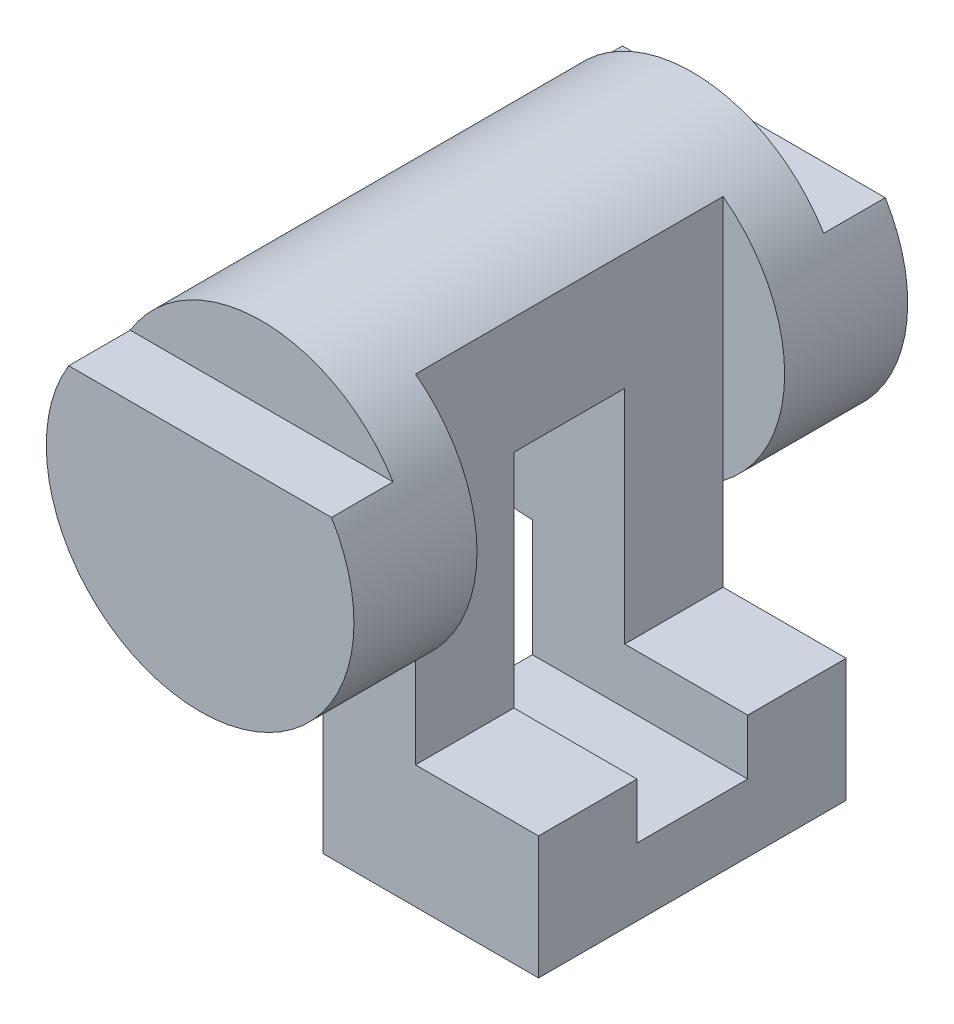
ISO-10303-21;
HEADER;
FILE_DESCRIPTION(('STEP AP214'),'2;1');
FILE_NAME('part.step','',(''),(''),'','','');
FILE_SCHEMA(('AUTOMOTIVE_DESIGN { 1 0 10303 214 1 1 1 1 }'));
ENDSEC;
DATA;
#1=APPLICATION_CONTEXT('core data for automotive mechanical design processes');
#2=APPLICATION_PROTOCOL_DEFINITION('international standard','automotive_design',2000,#1);
#3=PRODUCT_CONTEXT('',#1,'mechanical');
#4=PRODUCT('Part','Part','',(#3));
#5=PRODUCT_RELATED_PRODUCT_CATEGORY('part','',(#4));
#6=PRODUCT_DEFINITION_FORMATION('','',#4);
#7=PRODUCT_DEFINITION_CONTEXT('part definition',#1,'design');
#8=PRODUCT_DEFINITION('design','',#6,#7);
#9=PRODUCT_DEFINITION_SHAPE('','',#8);
#10=(LENGTH_UNIT() NAMED_UNIT(*) SI_UNIT(.MILLI.,.METRE.));
#11=(NAMED_UNIT(*) PLANE_ANGLE_UNIT() SI_UNIT($,.RADIAN.));
#12=(NAMED_UNIT(*) SI_UNIT($,.STERADIAN.) SOLID_ANGLE_UNIT());
#13=UNCERTAINTY_MEASURE_WITH_UNIT(LENGTH_MEASURE(1.E-05),#10,'distance_accuracy_value','');
#14=(GEOMETRIC_REPRESENTATION_CONTEXT(3) GLOBAL_UNCERTAINTY_ASSIGNED_CONTEXT((#13)) GLOBAL_UNIT_ASSIGNED_CONTEXT((#10,
#11,#12)) REPRESENTATION_CONTEXT('',''));
#15=CARTESIAN_POINT('',(0.,0.,0.));
#16=DIRECTION('',(0.,0.,1.));
#17=DIRECTION('',(1.,0.,0.));
#18=AXIS2_PLACEMENT_3D('',#15,#16,#17);
#19=CARTESIAN_POINT('',(-15.,35.,25.));
#20=DIRECTION('',(0.,0.,-1.));
#21=DIRECTION('',(-1.,0.,0.));
#22=AXIS2_PLACEMENT_3D('',#19,#20,#21);
#23=CYLINDRICAL_SURFACE('',#22,25.);
#24=CARTESIAN_POINT('',(-15.,35.,-45.));
#25=DIRECTION('',(0.,0.,1.));
#26=DIRECTION('',(1.,0.,0.));
#27=AXIS2_PLACEMENT_3D('',#24,#25,#26);
#28=CIRCLE('',#27,25.);
#29=CARTESIAN_POINT('',(-36.3541565040626,48.,-45.));
#30=VERTEX_POINT('',#29);
#31=CARTESIAN_POINT('',(6.35415650406259,48.,-45.));
#32=VERTEX_POINT('',#31);
#33=EDGE_CURVE('E196',#30,#32,#28,.T.);
#34=ORIENTED_EDGE('',*,*,#33,.T.);
#35=DIRECTION('',(0.,0.,-1.));
#36=VECTOR('',#35,1.);
#37=CARTESIAN_POINT('',(6.3541565040626,48.,25.));
#38=LINE('',#37,#36);
#39=CARTESIAN_POINT('',(6.3541565040626,48.,-35.));
#40=VERTEX_POINT('',#39);
#41=EDGE_CURVE('E321',#32,#40,#38,.F.);
#42=ORIENTED_EDGE('',*,*,#41,.T.);
#43=CARTESIAN_POINT('',(-15.,35.,-35.));
#44=DIRECTION('',(0.,0.,1.));
#45=DIRECTION('',(1.,0.,0.));
#46=AXIS2_PLACEMENT_3D('',#43,#44,#45);
#47=CIRCLE('',#46,25.);
#48=CARTESIAN_POINT('',(-36.3541565040626,48.,-35.));
#49=VERTEX_POINT('',#48);
#50=EDGE_CURVE('E252',#40,#49,#47,.T.);
#51=ORIENTED_EDGE('',*,*,#50,.T.);
#52=DIRECTION('',(0.,0.,-1.));
#53=VECTOR('',#52,1.);
#54=CARTESIAN_POINT('',(-36.3541565040626,48.,25.));
#55=LINE('',#54,#53);
#56=EDGE_CURVE('E289',#49,#30,#55,.T.);
#57=ORIENTED_EDGE('',*,*,#56,.T.);
#58=EDGE_LOOP('',(#34,#42,#51,#57));
#59=FACE_BOUND('',#58,.T.);
#60=CARTESIAN_POINT('',(-15.,35.,45.));
#61=DIRECTION('',(0.,0.,1.));
#62=DIRECTION('',(1.,0.,0.));
#63=AXIS2_PLACEMENT_3D('',#60,#61,#62);
#64=CIRCLE('',#63,25.);
#65=CARTESIAN_POINT('',(-36.3541565040626,48.,45.));
#66=VERTEX_POINT('',#65);
#67=CARTESIAN_POINT('',(6.3541565040626,48.,45.));
#68=VERTEX_POINT('',#67);
#69=EDGE_CURVE('E190',#66,#68,#64,.T.);
#70=ORIENTED_EDGE('',*,*,#69,.F.);
#71=DIRECTION('',(0.,0.,-1.));
#72=VECTOR('',#71,1.);
#73=CARTESIAN_POINT('',(-36.3541565040626,48.,25.));
#74=LINE('',#73,#72);
#75=CARTESIAN_POINT('',(-36.3541565040626,48.,35.));
#76=VERTEX_POINT('',#75);
#77=EDGE_CURVE('E318',#66,#76,#74,.T.);
#78=ORIENTED_EDGE('',*,*,#77,.T.);
#79=CARTESIAN_POINT('',(-15.,35.,35.));
#80=DIRECTION('',(0.,0.,-1.));
#81=DIRECTION('',(-1.,0.,0.));
#82=AXIS2_PLACEMENT_3D('',#79,#80,#81);
#83=CIRCLE('',#82,25.);
#84=CARTESIAN_POINT('',(6.35415650406261,48.,35.));
#85=VERTEX_POINT('',#84);
#86=EDGE_CURVE('E255',#76,#85,#83,.T.);
#87=ORIENTED_EDGE('',*,*,#86,.T.);
#88=DIRECTION('',(0.,0.,-1.));
#89=VECTOR('',#88,1.);
#90=CARTESIAN_POINT('',(6.35415650406261,48.,25.));
#91=LINE('',#90,#89);
#92=EDGE_CURVE('E301',#85,#68,#91,.F.);
#93=ORIENTED_EDGE('',*,*,#92,.T.);
#94=EDGE_LOOP('',(#70,#78,#87,#93));
#95=FACE_BOUND('',#94,.T.);
#96=CARTESIAN_POINT('',(-15.,35.,25.));
#97=DIRECTION('',(0.,0.,1.));
#98=DIRECTION('',(1.,0.,0.));
#99=AXIS2_PLACEMENT_3D('',#96,#97,#98);
#100=CIRCLE('',#99,25.);
#101=CARTESIAN_POINT('',(0.,15.,25.));
#102=VERTEX_POINT('',#101);
#103=CARTESIAN_POINT('',(-15.,10.,25.));
#104=VERTEX_POINT('',#103);
#105=EDGE_CURVE('E185',#102,#104,#100,.F.);
#106=ORIENTED_EDGE('',*,*,#105,.F.);
#107=CARTESIAN_POINT('',(-15.,35.,25.));
#108=DIRECTION('',(0.,0.,-1.));
#109=DIRECTION('',(-1.,0.,0.));
#110=AXIS2_PLACEMENT_3D('',#107,#108,#109);
#111=CIRCLE('',#110,25.);
#112=CARTESIAN_POINT('',(0.,55.,25.));
#113=VERTEX_POINT('',#112);
#114=EDGE_CURVE('E11',#113,#102,#111,.T.);
#115=ORIENTED_EDGE('',*,*,#114,.F.);
#116=DIRECTION('',(0.,0.,-1.));
#117=VECTOR('',#116,1.);
#118=CARTESIAN_POINT('',(0.,55.,25.));
#119=LINE('',#118,#117);
#120=CARTESIAN_POINT('',(0.,55.,-25.));
#121=VERTEX_POINT('',#120);
#122=EDGE_CURVE('E165',#121,#113,#119,.F.);
#123=ORIENTED_EDGE('',*,*,#122,.F.);
#124=CARTESIAN_POINT('',(-15.,35.,-25.));
#125=DIRECTION('',(0.,0.,1.));
#126=DIRECTION('',(1.,0.,0.));
#127=AXIS2_PLACEMENT_3D('',#124,#125,#126);
#128=CIRCLE('',#127,25.);
#129=CARTESIAN_POINT('',(0.,15.,-25.));
#130=VERTEX_POINT('',#129);
#131=EDGE_CURVE('E47',#130,#121,#128,.T.);
#132=ORIENTED_EDGE('',*,*,#131,.F.);
#133=CARTESIAN_POINT('',(-15.,35.,-25.));
#134=DIRECTION('',(0.,0.,1.));
#135=DIRECTION('',(1.,0.,0.));
#136=AXIS2_PLACEMENT_3D('',#133,#134,#135);
#137=CIRCLE('',#136,25.);
#138=CARTESIAN_POINT('',(-15.,10.,-25.));
#139=VERTEX_POINT('',#138);
#140=EDGE_CURVE('E235',#130,#139,#137,.F.);
#141=ORIENTED_EDGE('',*,*,#140,.T.);
#142=DIRECTION('',(0.,0.,-1.));
#143=VECTOR('',#142,1.);
#144=CARTESIAN_POINT('',(-15.,10.,25.));
#145=LINE('',#144,#143);
#146=CARTESIAN_POINT('',(-15.,10.,-9.));
#147=VERTEX_POINT('',#146);
#148=EDGE_CURVE('E222',#147,#139,#145,.T.);
#149=ORIENTED_EDGE('',*,*,#148,.F.);
#150=CARTESIAN_POINT('',(-15.,35.,-9.));
#151=DIRECTION('',(0.,0.,-1.));
#152=DIRECTION('',(-1.,0.,0.));
#153=AXIS2_PLACEMENT_3D('',#150,#151,#152);
#154=CIRCLE('',#153,25.);
#155=CARTESIAN_POINT('',(-39.9799919935936,36.,-9.));
#156=VERTEX_POINT('',#155);
#157=EDGE_CURVE('E287',#147,#156,#154,.T.);
#158=ORIENTED_EDGE('',*,*,#157,.T.);
#159=DIRECTION('',(0.,0.,-1.));
#160=VECTOR('',#159,1.);
#161=CARTESIAN_POINT('',(-39.9799919935936,36.,25.));
#162=LINE('',#161,#160);
#163=CARTESIAN_POINT('',(-39.9799919935936,36.,9.));
#164=VERTEX_POINT('',#163);
#165=EDGE_CURVE('E258',#156,#164,#162,.F.);
#166=ORIENTED_EDGE('',*,*,#165,.T.);
#167=CARTESIAN_POINT('',(-15.,35.,9.));
#168=DIRECTION('',(0.,0.,1.));
#169=DIRECTION('',(1.,0.,0.));
#170=AXIS2_PLACEMENT_3D('',#167,#168,#169);
#171=CIRCLE('',#170,25.);
#172=CARTESIAN_POINT('',(-15.,10.,9.));
#173=VERTEX_POINT('',#172);
#174=EDGE_CURVE('E328',#164,#173,#171,.T.);
#175=ORIENTED_EDGE('',*,*,#174,.T.);
#176=EDGE_CURVE('E187',#104,#173,#145,.T.);
#177=ORIENTED_EDGE('',*,*,#176,.F.);
#178=EDGE_LOOP('',(#106,#115,#123,#132,#141,#149,#158,#166,#175,#177));
#179=FACE_BOUND('',#178,.T.);
#180=ADVANCED_FACE('F39',(#59,#95,#179),#23,.T.);
#181=CARTESIAN_POINT('',(-40.,36.,9.));
#182=DIRECTION('',(0.,1.,0.));
#183=DIRECTION('',(-1.,0.,0.));
#184=AXIS2_PLACEMENT_3D('',#181,#182,#183);
#185=PLANE('',#184);
#186=DIRECTION('',(0.,0.,-1.));
#187=VECTOR('',#186,1.);
#188=CARTESIAN_POINT('',(0.,36.,9.));
#189=LINE('',#188,#187);
#190=CARTESIAN_POINT('',(0.,36.,9.));
#191=VERTEX_POINT('',#190);
#192=CARTESIAN_POINT('',(0.,36.,-9.));
#193=VERTEX_POINT('',#192);
#194=EDGE_CURVE('E177',#191,#193,#189,.T.);
#195=ORIENTED_EDGE('',*,*,#194,.F.);
#196=DIRECTION('',(1.,0.,0.));
#197=VECTOR('',#196,1.);
#198=CARTESIAN_POINT('',(-40.,36.,9.));
#199=LINE('',#198,#197);
#200=EDGE_CURVE('E298',#164,#191,#199,.T.);
#201=ORIENTED_EDGE('',*,*,#200,.F.);
#202=ORIENTED_EDGE('',*,*,#165,.F.);
#203=DIRECTION('',(1.,0.,0.));
#204=VECTOR('',#203,1.);
#205=CARTESIAN_POINT('',(-40.,36.,-9.));
#206=LINE('',#205,#204);
#207=EDGE_CURVE('E296',#156,#193,#206,.T.);
#208=ORIENTED_EDGE('',*,*,#207,.T.);
#209=EDGE_LOOP('',(#195,#201,#202,#208));
#210=FACE_BOUND('',#209,.T.);
#211=ADVANCED_FACE('F295',(#210),#185,.F.);
#212=CARTESIAN_POINT('',(-40.,-8.99999999999999,9.));
#213=DIRECTION('',(0.,0.,1.));
#214=DIRECTION('',(1.,0.,0.));
#215=AXIS2_PLACEMENT_3D('',#212,#213,#214);
#216=PLANE('',#215);
#217=ORIENTED_EDGE('',*,*,#200,.T.);
#218=DIRECTION('',(0.,1.,0.));
#219=VECTOR('',#218,1.);
#220=CARTESIAN_POINT('',(0.,0.,9.));
#221=LINE('',#220,#219);
#222=CARTESIAN_POINT('',(0.,0.,9.));
#223=VERTEX_POINT('',#222);
#224=EDGE_CURVE('E330',#223,#191,#221,.T.);
#225=ORIENTED_EDGE('',*,*,#224,.F.);
#226=DIRECTION('',(-1.,0.,0.));
#227=VECTOR('',#226,1.);
#228=CARTESIAN_POINT('',(20.,0.,9.));
#229=LINE('',#228,#227);
#230=CARTESIAN_POINT('',(20.,0.,9.));
#231=VERTEX_POINT('',#230);
#232=EDGE_CURVE('E332',#231,#223,#229,.T.);
#233=ORIENTED_EDGE('',*,*,#232,.F.);
#234=DIRECTION('',(0.,-1.,0.));
#235=VECTOR('',#234,1.);
#236=CARTESIAN_POINT('',(20.,-9.,9.));
#237=LINE('',#236,#235);
#238=CARTESIAN_POINT('',(20.,-9.,9.));
#239=VERTEX_POINT('',#238);
#240=EDGE_CURVE('E313',#231,#239,#237,.T.);
#241=ORIENTED_EDGE('',*,*,#240,.T.);
#242=DIRECTION('',(1.,0.,0.));
#243=VECTOR('',#242,1.);
#244=CARTESIAN_POINT('',(-40.,-8.99999999999999,9.));
#245=LINE('',#244,#243);
#246=CARTESIAN_POINT('',(-15.,-8.99999999999999,9.));
#247=VERTEX_POINT('',#246);
#248=EDGE_CURVE('E303',#247,#239,#245,.T.);
#249=ORIENTED_EDGE('',*,*,#248,.F.);
#250=DIRECTION('',(0.,-1.,0.));
#251=VECTOR('',#250,1.);
#252=CARTESIAN_POINT('',(-15.,10.,9.));
#253=LINE('',#252,#251);
#254=EDGE_CURVE('E249',#173,#247,#253,.T.);
#255=ORIENTED_EDGE('',*,*,#254,.F.);
#256=ORIENTED_EDGE('',*,*,#174,.F.);
#257=EDGE_LOOP('',(#217,#225,#233,#241,#249,#255,#256));
#258=FACE_BOUND('',#257,.T.);
#259=ADVANCED_FACE('F365',(#258),#216,.F.);
#260=CARTESIAN_POINT('',(-40.,-8.99999999999999,-9.));
#261=DIRECTION('',(0.,0.,-1.));
#262=DIRECTION('',(-1.,0.,0.));
#263=AXIS2_PLACEMENT_3D('',#260,#261,#262);
#264=PLANE('',#263);
#265=DIRECTION('',(0.,-1.,0.));
#266=VECTOR('',#265,1.);
#267=CARTESIAN_POINT('',(0.,0.,-9.));
#268=LINE('',#267,#266);
#269=CARTESIAN_POINT('',(0.,0.,-9.));
#270=VERTEX_POINT('',#269);
#271=EDGE_CURVE('E54',#193,#270,#268,.T.);
#272=ORIENTED_EDGE('',*,*,#271,.F.);
#273=ORIENTED_EDGE('',*,*,#207,.F.);
#274=ORIENTED_EDGE('',*,*,#157,.F.);
#275=DIRECTION('',(0.,1.,0.));
#276=VECTOR('',#275,1.);
#277=CARTESIAN_POINT('',(-15.,10.,-9.));
#278=LINE('',#277,#276);
#279=CARTESIAN_POINT('',(-15.,-8.99999999999999,-8.99999999999999));
#280=VERTEX_POINT('',#279);
#281=EDGE_CURVE('E246',#280,#147,#278,.T.);
#282=ORIENTED_EDGE('',*,*,#281,.F.);
#283=DIRECTION('',(1.,0.,0.));
#284=VECTOR('',#283,1.);
#285=CARTESIAN_POINT('',(-40.,-8.99999999999999,-9.));
#286=LINE('',#285,#284);
#287=CARTESIAN_POINT('',(20.,-9.,-9.));
#288=VERTEX_POINT('',#287);
#289=EDGE_CURVE('E62',#280,#288,#286,.T.);
#290=ORIENTED_EDGE('',*,*,#289,.T.);
#291=DIRECTION('',(0.,1.,0.));
#292=VECTOR('',#291,1.);
#293=CARTESIAN_POINT('',(20.,-9.,-9.));
#294=LINE('',#293,#292);
#295=CARTESIAN_POINT('',(20.,0.,-9.));
#296=VERTEX_POINT('',#295);
#297=EDGE_CURVE('E309',#288,#296,#294,.T.);
#298=ORIENTED_EDGE('',*,*,#297,.T.);
#299=DIRECTION('',(1.,0.,0.));
#300=VECTOR('',#299,1.);
#301=CARTESIAN_POINT('',(20.,0.,-9.));
#302=LINE('',#301,#300);
#303=EDGE_CURVE('E274',#270,#296,#302,.T.);
#304=ORIENTED_EDGE('',*,*,#303,.F.);
#305=EDGE_LOOP('',(#272,#273,#274,#282,#290,#298,#304));
#306=FACE_BOUND('',#305,.T.);
#307=ADVANCED_FACE('F299',(#306),#264,.F.);
#308=CARTESIAN_POINT('',(20.,0.,25.));
#309=DIRECTION('',(0.,-1.,0.));
#310=DIRECTION('',(1.,0.,0.));
#311=AXIS2_PLACEMENT_3D('',#308,#309,#310);
#312=PLANE('',#311);
#313=DIRECTION('',(0.,0.,-1.));
#314=VECTOR('',#313,1.);
#315=CARTESIAN_POINT('',(0.,0.,25.));
#316=LINE('',#315,#314);
#317=CARTESIAN_POINT('',(0.,0.,25.));
#318=VERTEX_POINT('',#317);
#319=EDGE_CURVE('E225',#318,#223,#316,.T.);
#320=ORIENTED_EDGE('',*,*,#319,.F.);
#321=DIRECTION('',(-1.,0.,0.));
#322=VECTOR('',#321,1.);
#323=CARTESIAN_POINT('',(20.,0.,25.));
#324=LINE('',#323,#322);
#325=CARTESIAN_POINT('',(20.,0.,25.));
#326=VERTEX_POINT('',#325);
#327=EDGE_CURVE('E206',#326,#318,#324,.T.);
#328=ORIENTED_EDGE('',*,*,#327,.F.);
#329=DIRECTION('',(0.,0.,-1.));
#330=VECTOR('',#329,1.);
#331=CARTESIAN_POINT('',(20.,0.,25.));
#332=LINE('',#331,#330);
#333=EDGE_CURVE('E229',#326,#231,#332,.T.);
#334=ORIENTED_EDGE('',*,*,#333,.T.);
#335=ORIENTED_EDGE('',*,*,#232,.T.);
#336=EDGE_LOOP('',(#320,#328,#334,#335));
#337=FACE_BOUND('',#336,.T.);
#338=ADVANCED_FACE('F373',(#337),#312,.F.);
#339=CARTESIAN_POINT('',(-15.,35.,25.));
#340=DIRECTION('',(0.,0.,1.));
#341=DIRECTION('',(1.,0.,0.));
#342=AXIS2_PLACEMENT_3D('',#339,#340,#341);
#343=PLANE('',#342);
#344=DIRECTION('',(0.,1.,0.));
#345=VECTOR('',#344,1.);
#346=CARTESIAN_POINT('',(0.,0.,25.));
#347=LINE('',#346,#345);
#348=EDGE_CURVE('E208',#318,#102,#347,.T.);
#349=ORIENTED_EDGE('',*,*,#348,.T.);
#350=ORIENTED_EDGE('',*,*,#105,.T.);
#351=DIRECTION('',(0.,-1.,0.));
#352=VECTOR('',#351,1.);
#353=CARTESIAN_POINT('',(-15.,10.,25.));
#354=LINE('',#353,#352);
#355=CARTESIAN_POINT('',(-15.,-20.,25.));
#356=VERTEX_POINT('',#355);
#357=EDGE_CURVE('E210',#104,#356,#354,.T.);
#358=ORIENTED_EDGE('',*,*,#357,.T.);
#359=DIRECTION('',(1.,0.,0.));
#360=VECTOR('',#359,1.);
#361=CARTESIAN_POINT('',(-15.,-20.,25.));
#362=LINE('',#361,#360);
#363=CARTESIAN_POINT('',(20.,-20.,25.));
#364=VERTEX_POINT('',#363);
#365=EDGE_CURVE('E200',#356,#364,#362,.T.);
#366=ORIENTED_EDGE('',*,*,#365,.T.);
#367=DIRECTION('',(0.,1.,0.));
#368=VECTOR('',#367,1.);
#369=CARTESIAN_POINT('',(20.,-20.,25.));
#370=LINE('',#369,#368);
#371=EDGE_CURVE('E203',#364,#326,#370,.T.);
#372=ORIENTED_EDGE('',*,*,#371,.T.);
#373=ORIENTED_EDGE('',*,*,#327,.T.);
#374=EDGE_LOOP('',(#349,#350,#358,#366,#372,#373));
#375=FACE_BOUND('',#374,.T.);
#376=ADVANCED_FACE('F381',(#375),#343,.T.);
#377=CARTESIAN_POINT('',(-15.,35.,-25.));
#378=DIRECTION('',(0.,0.,1.));
#379=DIRECTION('',(1.,0.,0.));
#380=AXIS2_PLACEMENT_3D('',#377,#378,#379);
#381=PLANE('',#380);
#382=ORIENTED_EDGE('',*,*,#140,.F.);
#383=DIRECTION('',(0.,1.,0.));
#384=VECTOR('',#383,1.);
#385=CARTESIAN_POINT('',(0.,0.,-25.));
#386=LINE('',#385,#384);
#387=CARTESIAN_POINT('',(0.,0.,-25.));
#388=VERTEX_POINT('',#387);
#389=EDGE_CURVE('E217',#388,#130,#386,.T.);
#390=ORIENTED_EDGE('',*,*,#389,.F.);
#391=DIRECTION('',(-1.,0.,0.));
#392=VECTOR('',#391,1.);
#393=CARTESIAN_POINT('',(20.,0.,-25.));
#394=LINE('',#393,#392);
#395=CARTESIAN_POINT('',(20.,0.,-25.));
#396=VERTEX_POINT('',#395);
#397=EDGE_CURVE('E215',#396,#388,#394,.T.);
#398=ORIENTED_EDGE('',*,*,#397,.F.);
#399=DIRECTION('',(0.,1.,0.));
#400=VECTOR('',#399,1.);
#401=CARTESIAN_POINT('',(20.,-20.,-25.));
#402=LINE('',#401,#400);
#403=CARTESIAN_POINT('',(20.,-20.,-25.));
#404=VERTEX_POINT('',#403);
#405=EDGE_CURVE('E193',#404,#396,#402,.T.);
#406=ORIENTED_EDGE('',*,*,#405,.F.);
#407=DIRECTION('',(1.,0.,0.));
#408=VECTOR('',#407,1.);
#409=CARTESIAN_POINT('',(-15.,-20.,-25.));
#410=LINE('',#409,#408);
#411=CARTESIAN_POINT('',(-15.,-20.,-25.));
#412=VERTEX_POINT('',#411);
#413=EDGE_CURVE('E189',#412,#404,#410,.T.);
#414=ORIENTED_EDGE('',*,*,#413,.F.);
#415=DIRECTION('',(0.,-1.,0.));
#416=VECTOR('',#415,1.);
#417=CARTESIAN_POINT('',(-15.,10.,-25.));
#418=LINE('',#417,#416);
#419=EDGE_CURVE('E204',#139,#412,#418,.T.);
#420=ORIENTED_EDGE('',*,*,#419,.F.);
#421=EDGE_LOOP('',(#382,#390,#398,#406,#414,#420));
#422=FACE_BOUND('',#421,.T.);
#423=ADVANCED_FACE('F267',(#422),#381,.F.);
#424=CARTESIAN_POINT('',(-15.,-20.,25.));
#425=DIRECTION('',(0.,1.,0.));
#426=DIRECTION('',(0.,0.,1.));
#427=AXIS2_PLACEMENT_3D('',#424,#425,#426);
#428=PLANE('',#427);
#429=ORIENTED_EDGE('',*,*,#413,.T.);
#430=DIRECTION('',(0.,0.,-1.));
#431=VECTOR('',#430,1.);
#432=CARTESIAN_POINT('',(20.,-20.,25.));
#433=LINE('',#432,#431);
#434=EDGE_CURVE('E232',#364,#404,#433,.T.);
#435=ORIENTED_EDGE('',*,*,#434,.F.);
#436=ORIENTED_EDGE('',*,*,#365,.F.);
#437=DIRECTION('',(0.,0.,-1.));
#438=VECTOR('',#437,1.);
#439=CARTESIAN_POINT('',(-15.,-20.,25.));
#440=LINE('',#439,#438);
#441=EDGE_CURVE('E211',#356,#412,#440,.T.);
#442=ORIENTED_EDGE('',*,*,#441,.T.);
#443=EDGE_LOOP('',(#429,#435,#436,#442));
#444=FACE_BOUND('',#443,.T.);
#445=ADVANCED_FACE('F41',(#444),#428,.F.);
#446=CARTESIAN_POINT('',(20.,-20.,25.));
#447=DIRECTION('',(-1.,0.,0.));
#448=DIRECTION('',(0.,-1.,0.));
#449=AXIS2_PLACEMENT_3D('',#446,#447,#448);
#450=PLANE('',#449);
#451=DIRECTION('',(0.,0.,-1.));
#452=VECTOR('',#451,1.);
#453=CARTESIAN_POINT('',(20.,-9.,9.));
#454=LINE('',#453,#452);
#455=EDGE_CURVE('E580',#239,#288,#454,.T.);
#456=ORIENTED_EDGE('',*,*,#455,.F.);
#457=ORIENTED_EDGE('',*,*,#240,.F.);
#458=ORIENTED_EDGE('',*,*,#333,.F.);
#459=ORIENTED_EDGE('',*,*,#371,.F.);
#460=ORIENTED_EDGE('',*,*,#434,.T.);
#461=ORIENTED_EDGE('',*,*,#405,.T.);
#462=EDGE_CURVE('E228',#296,#396,#332,.T.);
#463=ORIENTED_EDGE('',*,*,#462,.F.);
#464=ORIENTED_EDGE('',*,*,#297,.F.);
#465=EDGE_LOOP('',(#456,#457,#458,#459,#460,#461,#463,#464));
#466=FACE_BOUND('',#465,.T.);
#467=ADVANCED_FACE('F280',(#466),#450,.F.);
#468=ORIENTED_EDGE('',*,*,#303,.T.);
#469=ORIENTED_EDGE('',*,*,#462,.T.);
#470=ORIENTED_EDGE('',*,*,#397,.T.);
#471=EDGE_CURVE('E224',#270,#388,#316,.T.);
#472=ORIENTED_EDGE('',*,*,#471,.F.);
#473=EDGE_LOOP('',(#468,#469,#470,#472));
#474=FACE_BOUND('',#473,.T.);
#475=ADVANCED_FACE('F273',(#474),#312,.F.);
#476=CARTESIAN_POINT('',(0.,0.,25.));
#477=DIRECTION('',(-1.,0.,0.));
#478=DIRECTION('',(0.,0.,1.));
#479=AXIS2_PLACEMENT_3D('',#476,#477,#478);
#480=PLANE('',#479);
#481=ORIENTED_EDGE('',*,*,#389,.T.);
#482=DIRECTION('',(0.,-1.,0.));
#483=VECTOR('',#482,1.);
#484=CARTESIAN_POINT('',(0.,60.,-25.));
#485=LINE('',#484,#483);
#486=EDGE_CURVE('E172',#121,#130,#485,.T.);
#487=ORIENTED_EDGE('',*,*,#486,.F.);
#488=ORIENTED_EDGE('',*,*,#122,.T.);
#489=DIRECTION('',(0.,-1.,0.));
#490=VECTOR('',#489,1.);
#491=CARTESIAN_POINT('',(0.,60.,25.));
#492=LINE('',#491,#490);
#493=EDGE_CURVE('E170',#113,#102,#492,.T.);
#494=ORIENTED_EDGE('',*,*,#493,.T.);
#495=ORIENTED_EDGE('',*,*,#348,.F.);
#496=ORIENTED_EDGE('',*,*,#319,.T.);
#497=ORIENTED_EDGE('',*,*,#224,.T.);
#498=ORIENTED_EDGE('',*,*,#194,.T.);
#499=ORIENTED_EDGE('',*,*,#271,.T.);
#500=ORIENTED_EDGE('',*,*,#471,.T.);
#501=EDGE_LOOP('',(#481,#487,#488,#494,#495,#496,#497,#498,#499,#500));
#502=FACE_BOUND('',#501,.T.);
#503=ADVANCED_FACE('F168',(#502),#480,.F.);
#504=CARTESIAN_POINT('',(-15.,10.,25.));
#505=DIRECTION('',(1.,0.,0.));
#506=DIRECTION('',(0.,1.,0.));
#507=AXIS2_PLACEMENT_3D('',#504,#505,#506);
#508=PLANE('',#507);
#509=ORIENTED_EDGE('',*,*,#176,.T.);
#510=ORIENTED_EDGE('',*,*,#254,.T.);
#511=DIRECTION('',(0.,0.,-1.));
#512=VECTOR('',#511,1.);
#513=CARTESIAN_POINT('',(-15.,-8.99999999999999,25.));
#514=LINE('',#513,#512);
#515=EDGE_CURVE('E243',#247,#280,#514,.T.);
#516=ORIENTED_EDGE('',*,*,#515,.T.);
#517=ORIENTED_EDGE('',*,*,#281,.T.);
#518=ORIENTED_EDGE('',*,*,#148,.T.);
#519=ORIENTED_EDGE('',*,*,#419,.T.);
#520=ORIENTED_EDGE('',*,*,#441,.F.);
#521=ORIENTED_EDGE('',*,*,#357,.F.);
#522=EDGE_LOOP('',(#509,#510,#516,#517,#518,#519,#520,#521));
#523=FACE_BOUND('',#522,.T.);
#524=ADVANCED_FACE('F286',(#523),#508,.F.);
#525=CARTESIAN_POINT('',(0.,0.,-45.));
#526=DIRECTION('',(0.,0.,1.));
#527=DIRECTION('',(1.,0.,0.));
#528=AXIS2_PLACEMENT_3D('',#525,#526,#527);
#529=PLANE('',#528);
#530=ORIENTED_EDGE('',*,*,#33,.F.);
#531=DIRECTION('',(1.,0.,0.));
#532=VECTOR('',#531,1.);
#533=CARTESIAN_POINT('',(0.,48.,-45.));
#534=LINE('',#533,#532);
#535=EDGE_CURVE('E240',#30,#32,#534,.T.);
#536=ORIENTED_EDGE('',*,*,#535,.T.);
#537=EDGE_LOOP('',(#530,#536));
#538=FACE_BOUND('',#537,.T.);
#539=ADVANCED_FACE('F341',(#538),#529,.F.);
#540=CARTESIAN_POINT('',(0.,0.,45.));
#541=DIRECTION('',(0.,0.,1.));
#542=DIRECTION('',(1.,0.,0.));
#543=AXIS2_PLACEMENT_3D('',#540,#541,#542);
#544=PLANE('',#543);
#545=DIRECTION('',(1.,0.,0.));
#546=VECTOR('',#545,1.);
#547=CARTESIAN_POINT('',(0.,48.,45.));
#548=LINE('',#547,#546);
#549=EDGE_CURVE('E238',#66,#68,#548,.T.);
#550=ORIENTED_EDGE('',*,*,#549,.F.);
#551=ORIENTED_EDGE('',*,*,#69,.T.);
#552=EDGE_LOOP('',(#550,#551));
#553=FACE_BOUND('',#552,.T.);
#554=ADVANCED_FACE('F389',(#553),#544,.T.);
#555=CARTESIAN_POINT('',(-40.,48.,35.));
#556=DIRECTION('',(0.,0.,-1.));
#557=DIRECTION('',(-1.,0.,0.));
#558=AXIS2_PLACEMENT_3D('',#555,#556,#557);
#559=PLANE('',#558);
#560=DIRECTION('',(1.,0.,0.));
#561=VECTOR('',#560,1.);
#562=CARTESIAN_POINT('',(-40.,48.,35.));
#563=LINE('',#562,#561);
#564=EDGE_CURVE('E310',#76,#85,#563,.T.);
#565=ORIENTED_EDGE('',*,*,#564,.T.);
#566=ORIENTED_EDGE('',*,*,#86,.F.);
#567=EDGE_LOOP('',(#565,#566));
#568=FACE_BOUND('',#567,.T.);
#569=ADVANCED_FACE('F356',(#568),#559,.F.);
#570=CARTESIAN_POINT('',(-40.,48.,45.));
#571=DIRECTION('',(0.,-1.,0.));
#572=DIRECTION('',(1.,0.,0.));
#573=AXIS2_PLACEMENT_3D('',#570,#571,#572);
#574=PLANE('',#573);
#575=ORIENTED_EDGE('',*,*,#549,.T.);
#576=ORIENTED_EDGE('',*,*,#92,.F.);
#577=ORIENTED_EDGE('',*,*,#564,.F.);
#578=ORIENTED_EDGE('',*,*,#77,.F.);
#579=EDGE_LOOP('',(#575,#576,#577,#578));
#580=FACE_BOUND('',#579,.T.);
#581=ADVANCED_FACE('F348',(#580),#574,.F.);
#582=CARTESIAN_POINT('',(-40.,48.,-35.));
#583=DIRECTION('',(0.,0.,1.));
#584=DIRECTION('',(1.,0.,0.));
#585=AXIS2_PLACEMENT_3D('',#582,#583,#584);
#586=PLANE('',#585);
#587=DIRECTION('',(1.,0.,0.));
#588=VECTOR('',#587,1.);
#589=CARTESIAN_POINT('',(-40.,48.,-35.));
#590=LINE('',#589,#588);
#591=EDGE_CURVE('E176',#49,#40,#590,.T.);
#592=ORIENTED_EDGE('',*,*,#591,.F.);
#593=ORIENTED_EDGE('',*,*,#50,.F.);
#594=EDGE_LOOP('',(#592,#593));
#595=FACE_BOUND('',#594,.T.);
#596=ADVANCED_FACE('F346',(#595),#586,.F.);
#597=CARTESIAN_POINT('',(-40.,48.,-45.));
#598=DIRECTION('',(0.,-1.,0.));
#599=DIRECTION('',(1.,0.,0.));
#600=AXIS2_PLACEMENT_3D('',#597,#598,#599);
#601=PLANE('',#600);
#602=ORIENTED_EDGE('',*,*,#591,.T.);
#603=ORIENTED_EDGE('',*,*,#41,.F.);
#604=ORIENTED_EDGE('',*,*,#535,.F.);
#605=ORIENTED_EDGE('',*,*,#56,.F.);
#606=EDGE_LOOP('',(#602,#603,#604,#605));
#607=FACE_BOUND('',#606,.T.);
#608=ADVANCED_FACE('F343',(#607),#601,.F.);
#609=CARTESIAN_POINT('',(-40.,-8.99999999999999,9.));
#610=DIRECTION('',(0.,-1.,0.));
#611=DIRECTION('',(1.,0.,0.));
#612=AXIS2_PLACEMENT_3D('',#609,#610,#611);
#613=PLANE('',#612);
#614=ORIENTED_EDGE('',*,*,#248,.T.);
#615=ORIENTED_EDGE('',*,*,#455,.T.);
#616=ORIENTED_EDGE('',*,*,#289,.F.);
#617=ORIENTED_EDGE('',*,*,#515,.F.);
#618=EDGE_LOOP('',(#614,#615,#616,#617));
#619=FACE_BOUND('',#618,.T.);
#620=ADVANCED_FACE('F354',(#619),#613,.F.);
#621=CARTESIAN_POINT('',(0.,60.,25.));
#622=DIRECTION('',(0.,0.,-1.));
#623=DIRECTION('',(-1.,0.,0.));
#624=AXIS2_PLACEMENT_3D('',#621,#622,#623);
#625=PLANE('',#624);
#626=ORIENTED_EDGE('',*,*,#114,.T.);
#627=ORIENTED_EDGE('',*,*,#493,.F.);
#628=EDGE_LOOP('',(#626,#627));
#629=FACE_BOUND('',#628,.T.);
#630=ADVANCED_FACE('F180',(#629),#625,.T.);
#631=CARTESIAN_POINT('',(0.,60.,-25.));
#632=DIRECTION('',(0.,0.,1.));
#633=DIRECTION('',(1.,0.,0.));
#634=AXIS2_PLACEMENT_3D('',#631,#632,#633);
#635=PLANE('',#634);
#636=ORIENTED_EDGE('',*,*,#131,.T.);
#637=ORIENTED_EDGE('',*,*,#486,.T.);
#638=EDGE_LOOP('',(#636,#637));
#639=FACE_BOUND('',#638,.T.);
#640=ADVANCED_FACE('F261',(#639),#635,.T.);
#641=CLOSED_SHELL('',(#180,#211,#259,#307,#338,#376,#423,#445,#467,#475,#503,#524,#539,#554,
#569,#581,#596,#608,#620,#630,#640));
#642=MANIFOLD_SOLID_BREP('B2',#641);
#643=ADVANCED_BREP_SHAPE_REPRESENTATION('',(#18,#642),#14);
#644=SHAPE_DEFINITION_REPRESENTATION(#9,#643);
ENDSEC;
END-ISO-10303-21;
